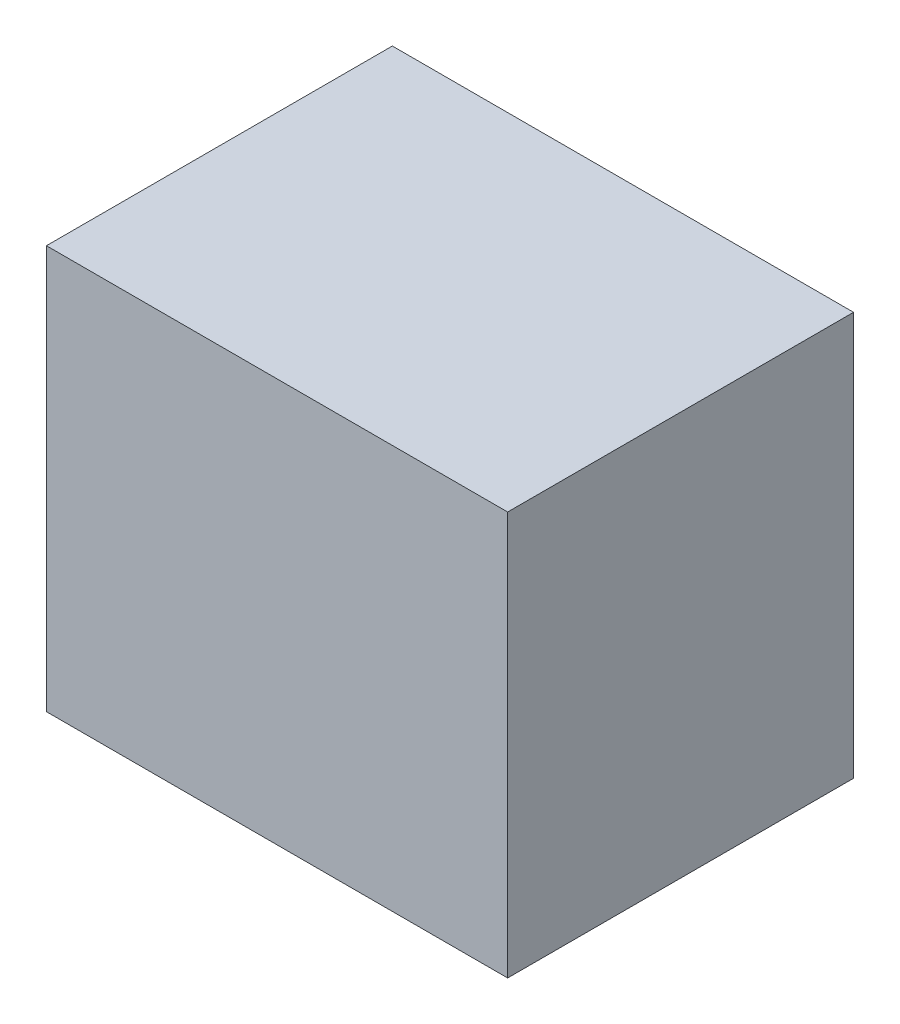
ISO-10303-21;
HEADER;
FILE_DESCRIPTION(('STEP AP214'),'2;1');
FILE_NAME('part.step','',(''),(''),'','','');
FILE_SCHEMA(('AUTOMOTIVE_DESIGN { 1 0 10303 214 1 1 1 1 }'));
ENDSEC;
DATA;
#1=APPLICATION_CONTEXT('core data for automotive mechanical design processes');
#2=APPLICATION_PROTOCOL_DEFINITION('international standard','automotive_design',2000,#1);
#3=PRODUCT_CONTEXT('',#1,'mechanical');
#4=PRODUCT('Part','Part','',(#3));
#5=PRODUCT_RELATED_PRODUCT_CATEGORY('part','',(#4));
#6=PRODUCT_DEFINITION_FORMATION('','',#4);
#7=PRODUCT_DEFINITION_CONTEXT('part definition',#1,'design');
#8=PRODUCT_DEFINITION('design','',#6,#7);
#9=PRODUCT_DEFINITION_SHAPE('','',#8);
#10=(LENGTH_UNIT() NAMED_UNIT(*) SI_UNIT(.MILLI.,.METRE.));
#11=(NAMED_UNIT(*) PLANE_ANGLE_UNIT() SI_UNIT($,.RADIAN.));
#12=(NAMED_UNIT(*) SI_UNIT($,.STERADIAN.) SOLID_ANGLE_UNIT());
#13=UNCERTAINTY_MEASURE_WITH_UNIT(LENGTH_MEASURE(1.E-05),#10,'distance_accuracy_value','');
#14=(GEOMETRIC_REPRESENTATION_CONTEXT(3) GLOBAL_UNCERTAINTY_ASSIGNED_CONTEXT((#13)) GLOBAL_UNIT_ASSIGNED_CONTEXT((#10,
#11,#12)) REPRESENTATION_CONTEXT('',''));
#15=CARTESIAN_POINT('',(0.,0.,0.));
#16=DIRECTION('',(0.,0.,1.));
#17=DIRECTION('',(1.,0.,0.));
#18=AXIS2_PLACEMENT_3D('',#15,#16,#17);
#19=CARTESIAN_POINT('',(0.,0.,600.));
#20=DIRECTION('',(1.,0.,0.));
#21=DIRECTION('',(0.,0.,-1.));
#22=AXIS2_PLACEMENT_3D('',#19,#20,#21);
#23=PLANE('',#22);
#24=DIRECTION('',(0.,-1.,0.));
#25=VECTOR('',#24,1.);
#26=CARTESIAN_POINT('',(0.,0.,0.));
#27=LINE('',#26,#25);
#28=CARTESIAN_POINT('',(0.,700.,0.));
#29=VERTEX_POINT('',#28);
#30=CARTESIAN_POINT('',(0.,0.,0.));
#31=VERTEX_POINT('',#30);
#32=EDGE_CURVE('E107',#29,#31,#27,.T.);
#33=ORIENTED_EDGE('',*,*,#32,.T.);
#34=DIRECTION('',(0.,0.,-1.));
#35=VECTOR('',#34,1.);
#36=CARTESIAN_POINT('',(0.,0.,600.));
#37=LINE('',#36,#35);
#38=CARTESIAN_POINT('',(0.,0.,600.));
#39=VERTEX_POINT('',#38);
#40=EDGE_CURVE('E11',#39,#31,#37,.T.);
#41=ORIENTED_EDGE('',*,*,#40,.F.);
#42=DIRECTION('',(0.,-1.,0.));
#43=VECTOR('',#42,1.);
#44=CARTESIAN_POINT('',(0.,0.,600.));
#45=LINE('',#44,#43);
#46=CARTESIAN_POINT('',(0.,700.,600.));
#47=VERTEX_POINT('',#46);
#48=EDGE_CURVE('E91',#47,#39,#45,.T.);
#49=ORIENTED_EDGE('',*,*,#48,.F.);
#50=DIRECTION('',(0.,0.,-1.));
#51=VECTOR('',#50,1.);
#52=CARTESIAN_POINT('',(0.,700.,600.));
#53=LINE('',#52,#51);
#54=EDGE_CURVE('E103',#47,#29,#53,.T.);
#55=ORIENTED_EDGE('',*,*,#54,.T.);
#56=EDGE_LOOP('',(#33,#41,#49,#55));
#57=FACE_BOUND('',#56,.T.);
#58=ADVANCED_FACE('F39',(#57),#23,.F.);
#59=CARTESIAN_POINT('',(0.,0.,600.));
#60=DIRECTION('',(0.,1.,0.));
#61=DIRECTION('',(0.,0.,1.));
#62=AXIS2_PLACEMENT_3D('',#59,#60,#61);
#63=PLANE('',#62);
#64=DIRECTION('',(1.,0.,0.));
#65=VECTOR('',#64,1.);
#66=CARTESIAN_POINT('',(0.,0.,0.));
#67=LINE('',#66,#65);
#68=CARTESIAN_POINT('',(800.,0.,0.));
#69=VERTEX_POINT('',#68);
#70=EDGE_CURVE('E96',#31,#69,#67,.T.);
#71=ORIENTED_EDGE('',*,*,#70,.T.);
#72=DIRECTION('',(0.,0.,-1.));
#73=VECTOR('',#72,1.);
#74=CARTESIAN_POINT('',(800.,0.,600.));
#75=LINE('',#74,#73);
#76=CARTESIAN_POINT('',(800.,0.,600.));
#77=VERTEX_POINT('',#76);
#78=EDGE_CURVE('E48',#77,#69,#75,.T.);
#79=ORIENTED_EDGE('',*,*,#78,.F.);
#80=DIRECTION('',(1.,0.,0.));
#81=VECTOR('',#80,1.);
#82=CARTESIAN_POINT('',(0.,0.,600.));
#83=LINE('',#82,#81);
#84=EDGE_CURVE('E86',#39,#77,#83,.T.);
#85=ORIENTED_EDGE('',*,*,#84,.F.);
#86=ORIENTED_EDGE('',*,*,#40,.T.);
#87=EDGE_LOOP('',(#71,#79,#85,#86));
#88=FACE_BOUND('',#87,.T.);
#89=ADVANCED_FACE('F95',(#88),#63,.F.);
#90=CARTESIAN_POINT('',(800.,0.,600.));
#91=DIRECTION('',(-1.,0.,0.));
#92=DIRECTION('',(0.,0.,1.));
#93=AXIS2_PLACEMENT_3D('',#90,#91,#92);
#94=PLANE('',#93);
#95=DIRECTION('',(0.,1.,0.));
#96=VECTOR('',#95,1.);
#97=CARTESIAN_POINT('',(800.,0.,0.));
#98=LINE('',#97,#96);
#99=CARTESIAN_POINT('',(800.,700.,0.));
#100=VERTEX_POINT('',#99);
#101=EDGE_CURVE('E73',#69,#100,#98,.T.);
#102=ORIENTED_EDGE('',*,*,#101,.T.);
#103=DIRECTION('',(0.,0.,-1.));
#104=VECTOR('',#103,1.);
#105=CARTESIAN_POINT('',(800.,700.,600.));
#106=LINE('',#105,#104);
#107=CARTESIAN_POINT('',(800.,700.,600.));
#108=VERTEX_POINT('',#107);
#109=EDGE_CURVE('E98',#108,#100,#106,.T.);
#110=ORIENTED_EDGE('',*,*,#109,.F.);
#111=DIRECTION('',(0.,1.,0.));
#112=VECTOR('',#111,1.);
#113=CARTESIAN_POINT('',(800.,0.,600.));
#114=LINE('',#113,#112);
#115=EDGE_CURVE('E89',#77,#108,#114,.T.);
#116=ORIENTED_EDGE('',*,*,#115,.F.);
#117=ORIENTED_EDGE('',*,*,#78,.T.);
#118=EDGE_LOOP('',(#102,#110,#116,#117));
#119=FACE_BOUND('',#118,.T.);
#120=ADVANCED_FACE('F99',(#119),#94,.F.);
#121=CARTESIAN_POINT('',(0.,700.,600.));
#122=DIRECTION('',(0.,-1.,0.));
#123=DIRECTION('',(0.,0.,-1.));
#124=AXIS2_PLACEMENT_3D('',#121,#122,#123);
#125=PLANE('',#124);
#126=DIRECTION('',(-1.,0.,0.));
#127=VECTOR('',#126,1.);
#128=CARTESIAN_POINT('',(0.,700.,0.));
#129=LINE('',#128,#127);
#130=EDGE_CURVE('E79',#100,#29,#129,.T.);
#131=ORIENTED_EDGE('',*,*,#130,.T.);
#132=ORIENTED_EDGE('',*,*,#54,.F.);
#133=DIRECTION('',(-1.,0.,0.));
#134=VECTOR('',#133,1.);
#135=CARTESIAN_POINT('',(0.,700.,600.));
#136=LINE('',#135,#134);
#137=EDGE_CURVE('E56',#108,#47,#136,.T.);
#138=ORIENTED_EDGE('',*,*,#137,.F.);
#139=ORIENTED_EDGE('',*,*,#109,.T.);
#140=EDGE_LOOP('',(#131,#132,#138,#139));
#141=FACE_BOUND('',#140,.T.);
#142=ADVANCED_FACE('F120',(#141),#125,.F.);
#143=CARTESIAN_POINT('',(0.,0.,600.));
#144=DIRECTION('',(0.,0.,-1.));
#145=DIRECTION('',(-1.,0.,0.));
#146=AXIS2_PLACEMENT_3D('',#143,#144,#145);
#147=PLANE('',#146);
#148=ORIENTED_EDGE('',*,*,#48,.T.);
#149=ORIENTED_EDGE('',*,*,#84,.T.);
#150=ORIENTED_EDGE('',*,*,#115,.T.);
#151=ORIENTED_EDGE('',*,*,#137,.T.);
#152=EDGE_LOOP('',(#148,#149,#150,#151));
#153=FACE_BOUND('',#152,.T.);
#154=ADVANCED_FACE('F87',(#153),#147,.F.);
#155=CARTESIAN_POINT('',(0.,0.,0.));
#156=DIRECTION('',(0.,0.,-1.));
#157=DIRECTION('',(-1.,0.,0.));
#158=AXIS2_PLACEMENT_3D('',#155,#156,#157);
#159=PLANE('',#158);
#160=ORIENTED_EDGE('',*,*,#32,.F.);
#161=ORIENTED_EDGE('',*,*,#130,.F.);
#162=ORIENTED_EDGE('',*,*,#101,.F.);
#163=ORIENTED_EDGE('',*,*,#70,.F.);
#164=EDGE_LOOP('',(#160,#161,#162,#163));
#165=FACE_BOUND('',#164,.T.);
#166=ADVANCED_FACE('F123',(#165),#159,.T.);
#167=CLOSED_SHELL('',(#58,#89,#120,#142,#154,#166));
#168=MANIFOLD_SOLID_BREP('B2',#167);
#169=ADVANCED_BREP_SHAPE_REPRESENTATION('',(#18,#168),#14);
#170=SHAPE_DEFINITION_REPRESENTATION(#9,#169);
ENDSEC;
END-ISO-10303-21;
